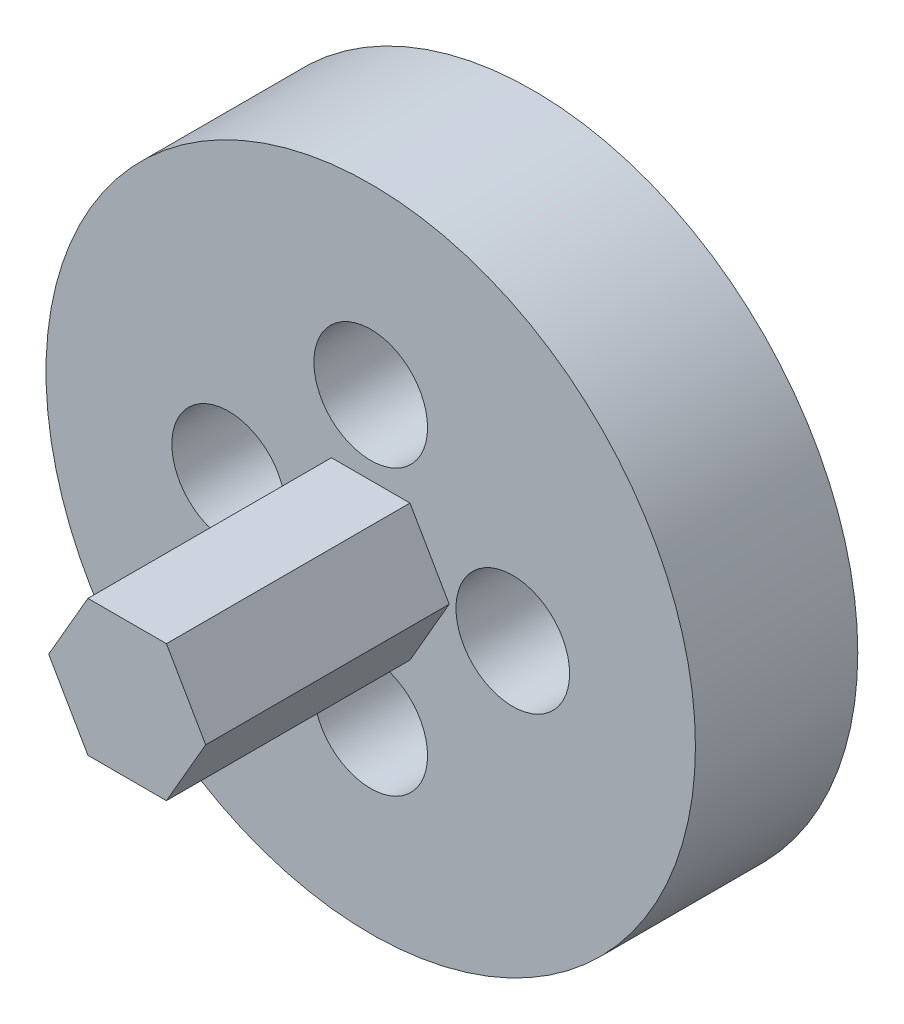
ISO-10303-21;
HEADER;
FILE_DESCRIPTION(('STEP AP214'),'2;1');
FILE_NAME('part.step','',(''),(''),'','','');
FILE_SCHEMA(('AUTOMOTIVE_DESIGN { 1 0 10303 214 1 1 1 1 }'));
ENDSEC;
DATA;
#1=APPLICATION_CONTEXT('core data for automotive mechanical design processes');
#2=APPLICATION_PROTOCOL_DEFINITION('international standard','automotive_design',2000,#1);
#3=PRODUCT_CONTEXT('',#1,'mechanical');
#4=PRODUCT('Part','Part','',(#3));
#5=PRODUCT_RELATED_PRODUCT_CATEGORY('part','',(#4));
#6=PRODUCT_DEFINITION_FORMATION('','',#4);
#7=PRODUCT_DEFINITION_CONTEXT('part definition',#1,'design');
#8=PRODUCT_DEFINITION('design','',#6,#7);
#9=PRODUCT_DEFINITION_SHAPE('','',#8);
#10=(LENGTH_UNIT() NAMED_UNIT(*) SI_UNIT(.MILLI.,.METRE.));
#11=(NAMED_UNIT(*) PLANE_ANGLE_UNIT() SI_UNIT($,.RADIAN.));
#12=(NAMED_UNIT(*) SI_UNIT($,.STERADIAN.) SOLID_ANGLE_UNIT());
#13=UNCERTAINTY_MEASURE_WITH_UNIT(LENGTH_MEASURE(1.E-05),#10,'distance_accuracy_value','');
#14=(GEOMETRIC_REPRESENTATION_CONTEXT(3) GLOBAL_UNCERTAINTY_ASSIGNED_CONTEXT((#13)) GLOBAL_UNIT_ASSIGNED_CONTEXT((#10,
#11,#12)) REPRESENTATION_CONTEXT('',''));
#15=CARTESIAN_POINT('',(0.,0.,0.));
#16=DIRECTION('',(0.,0.,1.));
#17=DIRECTION('',(1.,0.,0.));
#18=AXIS2_PLACEMENT_3D('',#15,#16,#17);
#19=CARTESIAN_POINT('',(0.,7.,2.));
#20=DIRECTION('',(0.,0.,-1.));
#21=DIRECTION('',(-1.,0.,0.));
#22=AXIS2_PLACEMENT_3D('',#19,#20,#21);
#23=CYLINDRICAL_SURFACE('',#22,1.65);
#24=CARTESIAN_POINT('',(0.,7.,0.));
#25=DIRECTION('',(0.,0.,1.));
#26=DIRECTION('',(1.,0.,0.));
#27=AXIS2_PLACEMENT_3D('',#24,#25,#26);
#28=CIRCLE('',#27,1.65);
#29=CARTESIAN_POINT('',(1.65,7.,0.));
#30=VERTEX_POINT('',#29);
#31=EDGE_CURVE('E150',#30,#30,#28,.T.);
#32=ORIENTED_EDGE('',*,*,#31,.F.);
#33=EDGE_LOOP('',(#32));
#34=FACE_BOUND('',#33,.T.);
#35=CARTESIAN_POINT('',(0.,7.,4.4));
#36=DIRECTION('',(0.,0.,1.));
#37=DIRECTION('',(1.,0.,0.));
#38=AXIS2_PLACEMENT_3D('',#35,#36,#37);
#39=CIRCLE('',#38,1.65);
#40=CARTESIAN_POINT('',(1.65,7.,4.4));
#41=VERTEX_POINT('',#40);
#42=EDGE_CURVE('E49',#41,#41,#39,.T.);
#43=ORIENTED_EDGE('',*,*,#42,.T.);
#44=EDGE_LOOP('',(#43));
#45=FACE_BOUND('',#44,.T.);
#46=ADVANCED_FACE('F45',(#34,#45),#23,.F.);
#47=CARTESIAN_POINT('',(7.,0.,2.));
#48=DIRECTION('',(0.,0.,-1.));
#49=DIRECTION('',(-1.,0.,0.));
#50=AXIS2_PLACEMENT_3D('',#47,#48,#49);
#51=CYLINDRICAL_SURFACE('',#50,1.65);
#52=CARTESIAN_POINT('',(7.,0.,0.));
#53=DIRECTION('',(0.,0.,1.));
#54=DIRECTION('',(1.,0.,0.));
#55=AXIS2_PLACEMENT_3D('',#52,#53,#54);
#56=CIRCLE('',#55,1.65);
#57=CARTESIAN_POINT('',(8.65,0.,0.));
#58=VERTEX_POINT('',#57);
#59=EDGE_CURVE('E146',#58,#58,#56,.T.);
#60=ORIENTED_EDGE('',*,*,#59,.F.);
#61=EDGE_LOOP('',(#60));
#62=FACE_BOUND('',#61,.T.);
#63=CARTESIAN_POINT('',(7.,0.,4.4));
#64=DIRECTION('',(0.,0.,1.));
#65=DIRECTION('',(1.,0.,0.));
#66=AXIS2_PLACEMENT_3D('',#63,#64,#65);
#67=CIRCLE('',#66,1.65);
#68=CARTESIAN_POINT('',(8.65,0.,4.4));
#69=VERTEX_POINT('',#68);
#70=EDGE_CURVE('E165',#69,#69,#67,.T.);
#71=ORIENTED_EDGE('',*,*,#70,.T.);
#72=EDGE_LOOP('',(#71));
#73=FACE_BOUND('',#72,.T.);
#74=ADVANCED_FACE('F299',(#62,#73),#51,.F.);
#75=CARTESIAN_POINT('',(0.,-7.,2.));
#76=DIRECTION('',(0.,0.,-1.));
#77=DIRECTION('',(-1.,0.,0.));
#78=AXIS2_PLACEMENT_3D('',#75,#76,#77);
#79=CYLINDRICAL_SURFACE('',#78,1.65);
#80=CARTESIAN_POINT('',(0.,-7.,0.));
#81=DIRECTION('',(0.,0.,1.));
#82=DIRECTION('',(1.,0.,0.));
#83=AXIS2_PLACEMENT_3D('',#80,#81,#82);
#84=CIRCLE('',#83,1.65);
#85=CARTESIAN_POINT('',(1.65,-7.,0.));
#86=VERTEX_POINT('',#85);
#87=EDGE_CURVE('E142',#86,#86,#84,.T.);
#88=ORIENTED_EDGE('',*,*,#87,.F.);
#89=EDGE_LOOP('',(#88));
#90=FACE_BOUND('',#89,.T.);
#91=CARTESIAN_POINT('',(0.,-7.,4.4));
#92=DIRECTION('',(0.,0.,1.));
#93=DIRECTION('',(1.,0.,0.));
#94=AXIS2_PLACEMENT_3D('',#91,#92,#93);
#95=CIRCLE('',#94,1.65);
#96=CARTESIAN_POINT('',(1.65,-7.,4.4));
#97=VERTEX_POINT('',#96);
#98=EDGE_CURVE('E161',#97,#97,#95,.T.);
#99=ORIENTED_EDGE('',*,*,#98,.T.);
#100=EDGE_LOOP('',(#99));
#101=FACE_BOUND('',#100,.T.);
#102=ADVANCED_FACE('F305',(#90,#101),#79,.F.);
#103=CARTESIAN_POINT('',(-7.,0.,2.));
#104=DIRECTION('',(0.,0.,-1.));
#105=DIRECTION('',(-1.,0.,0.));
#106=AXIS2_PLACEMENT_3D('',#103,#104,#105);
#107=CYLINDRICAL_SURFACE('',#106,1.65);
#108=CARTESIAN_POINT('',(-7.,0.,0.));
#109=DIRECTION('',(0.,0.,1.));
#110=DIRECTION('',(1.,0.,0.));
#111=AXIS2_PLACEMENT_3D('',#108,#109,#110);
#112=CIRCLE('',#111,1.65);
#113=CARTESIAN_POINT('',(-5.35,0.,0.));
#114=VERTEX_POINT('',#113);
#115=EDGE_CURVE('E137',#114,#114,#112,.T.);
#116=ORIENTED_EDGE('',*,*,#115,.F.);
#117=EDGE_LOOP('',(#116));
#118=FACE_BOUND('',#117,.T.);
#119=CARTESIAN_POINT('',(-7.,0.,4.4));
#120=DIRECTION('',(0.,0.,1.));
#121=DIRECTION('',(1.,0.,0.));
#122=AXIS2_PLACEMENT_3D('',#119,#120,#121);
#123=CIRCLE('',#122,1.65);
#124=CARTESIAN_POINT('',(-5.35,0.,4.4));
#125=VERTEX_POINT('',#124);
#126=EDGE_CURVE('E157',#125,#125,#123,.T.);
#127=ORIENTED_EDGE('',*,*,#126,.T.);
#128=EDGE_LOOP('',(#127));
#129=FACE_BOUND('',#128,.T.);
#130=ADVANCED_FACE('F312',(#118,#129),#107,.F.);
#131=CARTESIAN_POINT('',(0.,0.,0.));
#132=DIRECTION('',(0.,0.,1.));
#133=DIRECTION('',(1.,0.,0.));
#134=AXIS2_PLACEMENT_3D('',#131,#132,#133);
#135=PLANE('',#134);
#136=CARTESIAN_POINT('',(0.,0.,0.));
#137=DIRECTION('',(0.,0.,1.));
#138=DIRECTION('',(1.,0.,0.));
#139=AXIS2_PLACEMENT_3D('',#136,#137,#138);
#140=CIRCLE('',#139,10.);
#141=CARTESIAN_POINT('',(10.,0.,0.));
#142=VERTEX_POINT('',#141);
#143=EDGE_CURVE('E55',#142,#142,#140,.T.);
#144=ORIENTED_EDGE('',*,*,#143,.F.);
#145=EDGE_LOOP('',(#144));
#146=FACE_BOUND('',#145,.T.);
#147=ORIENTED_EDGE('',*,*,#31,.T.);
#148=EDGE_LOOP('',(#147));
#149=FACE_BOUND('',#148,.T.);
#150=ORIENTED_EDGE('',*,*,#59,.T.);
#151=EDGE_LOOP('',(#150));
#152=FACE_BOUND('',#151,.T.);
#153=ORIENTED_EDGE('',*,*,#87,.T.);
#154=EDGE_LOOP('',(#153));
#155=FACE_BOUND('',#154,.T.);
#156=ORIENTED_EDGE('',*,*,#115,.T.);
#157=EDGE_LOOP('',(#156));
#158=FACE_BOUND('',#157,.T.);
#159=ADVANCED_FACE('F310',(#146,#149,#152,#155,#158),#135,.F.);
#160=CARTESIAN_POINT('',(0.,0.,2.));
#161=DIRECTION('',(0.,0.,-1.));
#162=DIRECTION('',(-1.,0.,0.));
#163=AXIS2_PLACEMENT_3D('',#160,#161,#162);
#164=CYLINDRICAL_SURFACE('',#163,10.);
#165=CARTESIAN_POINT('',(0.,0.,2.));
#166=DIRECTION('',(0.,0.,1.));
#167=DIRECTION('',(1.,0.,0.));
#168=AXIS2_PLACEMENT_3D('',#165,#166,#167);
#169=CIRCLE('',#168,10.);
#170=CARTESIAN_POINT('',(10.,0.,2.));
#171=VERTEX_POINT('',#170);
#172=EDGE_CURVE('E11',#171,#171,#169,.T.);
#173=ORIENTED_EDGE('',*,*,#172,.F.);
#174=EDGE_LOOP('',(#173));
#175=FACE_BOUND('',#174,.T.);
#176=ORIENTED_EDGE('',*,*,#143,.T.);
#177=EDGE_LOOP('',(#176));
#178=FACE_BOUND('',#177,.T.);
#179=ADVANCED_FACE('F47',(#175,#178),#164,.T.);
#180=CARTESIAN_POINT('',(0.,0.,2.));
#181=DIRECTION('',(0.,0.,1.));
#182=DIRECTION('',(1.,0.,0.));
#183=AXIS2_PLACEMENT_3D('',#180,#181,#182);
#184=PLANE('',#183);
#185=ORIENTED_EDGE('',*,*,#172,.T.);
#186=EDGE_LOOP('',(#185));
#187=FACE_BOUND('',#186,.T.);
#188=CARTESIAN_POINT('',(0.,0.,2.));
#189=DIRECTION('',(0.,0.,1.));
#190=DIRECTION('',(1.,0.,0.));
#191=AXIS2_PLACEMENT_3D('',#188,#189,#190);
#192=CIRCLE('',#191,16.);
#193=CARTESIAN_POINT('',(16.,0.,2.));
#194=VERTEX_POINT('',#193);
#195=EDGE_CURVE('E124',#194,#194,#192,.T.);
#196=ORIENTED_EDGE('',*,*,#195,.F.);
#197=EDGE_LOOP('',(#196));
#198=FACE_BOUND('',#197,.T.);
#199=ADVANCED_FACE('F275',(#187,#198),#184,.F.);
#200=CARTESIAN_POINT('',(0.,0.,10.));
#201=DIRECTION('',(0.,0.,1.));
#202=DIRECTION('',(1.,0.,0.));
#203=AXIS2_PLACEMENT_3D('',#200,#201,#202);
#204=PLANE('',#203);
#205=CARTESIAN_POINT('',(0.,7.,10.));
#206=DIRECTION('',(0.,0.,1.));
#207=DIRECTION('',(1.,0.,0.));
#208=AXIS2_PLACEMENT_3D('',#205,#206,#207);
#209=CIRCLE('',#208,2.8);
#210=CARTESIAN_POINT('',(2.8,7.,10.));
#211=VERTEX_POINT('',#210);
#212=EDGE_CURVE('E255',#211,#211,#209,.T.);
#213=ORIENTED_EDGE('',*,*,#212,.F.);
#214=EDGE_LOOP('',(#213));
#215=FACE_BOUND('',#214,.T.);
#216=CARTESIAN_POINT('',(7.,0.,10.));
#217=DIRECTION('',(0.,0.,1.));
#218=DIRECTION('',(1.,0.,0.));
#219=AXIS2_PLACEMENT_3D('',#216,#217,#218);
#220=CIRCLE('',#219,2.8);
#221=CARTESIAN_POINT('',(9.8,0.,10.));
#222=VERTEX_POINT('',#221);
#223=EDGE_CURVE('E251',#222,#222,#220,.T.);
#224=ORIENTED_EDGE('',*,*,#223,.F.);
#225=EDGE_LOOP('',(#224));
#226=FACE_BOUND('',#225,.T.);
#227=CARTESIAN_POINT('',(0.,-7.,10.));
#228=DIRECTION('',(0.,0.,1.));
#229=DIRECTION('',(1.,0.,0.));
#230=AXIS2_PLACEMENT_3D('',#227,#228,#229);
#231=CIRCLE('',#230,2.8);
#232=CARTESIAN_POINT('',(2.8,-7.,10.));
#233=VERTEX_POINT('',#232);
#234=EDGE_CURVE('E243',#233,#233,#231,.T.);
#235=ORIENTED_EDGE('',*,*,#234,.F.);
#236=EDGE_LOOP('',(#235));
#237=FACE_BOUND('',#236,.T.);
#238=CARTESIAN_POINT('',(-7.,0.,10.));
#239=DIRECTION('',(0.,0.,1.));
#240=DIRECTION('',(1.,0.,0.));
#241=AXIS2_PLACEMENT_3D('',#238,#239,#240);
#242=CIRCLE('',#241,2.8);
#243=CARTESIAN_POINT('',(-4.2,0.,10.));
#244=VERTEX_POINT('',#243);
#245=EDGE_CURVE('E235',#244,#244,#242,.T.);
#246=ORIENTED_EDGE('',*,*,#245,.F.);
#247=EDGE_LOOP('',(#246));
#248=FACE_BOUND('',#247,.T.);
#249=DIRECTION('',(0.5,0.866025403784439,0.));
#250=VECTOR('',#249,1.);
#251=CARTESIAN_POINT('',(1.93412340178525,-3.35,10.));
#252=LINE('',#251,#250);
#253=CARTESIAN_POINT('',(1.93412340178525,-3.35,10.));
#254=VERTEX_POINT('',#253);
#255=CARTESIAN_POINT('',(3.86824680357049,0.,10.));
#256=VERTEX_POINT('',#255);
#257=EDGE_CURVE('E63',#254,#256,#252,.T.);
#258=ORIENTED_EDGE('',*,*,#257,.F.);
#259=DIRECTION('',(1.,0.,0.));
#260=VECTOR('',#259,1.);
#261=CARTESIAN_POINT('',(-1.93412340178525,-3.35,10.));
#262=LINE('',#261,#260);
#263=CARTESIAN_POINT('',(-1.93412340178525,-3.35,10.));
#264=VERTEX_POINT('',#263);
#265=EDGE_CURVE('E67',#264,#254,#262,.T.);
#266=ORIENTED_EDGE('',*,*,#265,.F.);
#267=DIRECTION('',(0.5,-0.866025403784439,0.));
#268=VECTOR('',#267,1.);
#269=CARTESIAN_POINT('',(-3.86824680357049,0.,10.));
#270=LINE('',#269,#268);
#271=CARTESIAN_POINT('',(-3.86824680357049,0.,10.));
#272=VERTEX_POINT('',#271);
#273=EDGE_CURVE('E190',#272,#264,#270,.T.);
#274=ORIENTED_EDGE('',*,*,#273,.F.);
#275=DIRECTION('',(-0.5,-0.866025403784439,0.));
#276=VECTOR('',#275,1.);
#277=CARTESIAN_POINT('',(-1.93412340178525,3.35,10.));
#278=LINE('',#277,#276);
#279=CARTESIAN_POINT('',(-1.93412340178525,3.35,10.));
#280=VERTEX_POINT('',#279);
#281=EDGE_CURVE('E186',#280,#272,#278,.T.);
#282=ORIENTED_EDGE('',*,*,#281,.F.);
#283=DIRECTION('',(-1.,0.,0.));
#284=VECTOR('',#283,1.);
#285=CARTESIAN_POINT('',(1.93412340178524,3.35,10.));
#286=LINE('',#285,#284);
#287=CARTESIAN_POINT('',(1.93412340178524,3.35,10.));
#288=VERTEX_POINT('',#287);
#289=EDGE_CURVE('E178',#288,#280,#286,.T.);
#290=ORIENTED_EDGE('',*,*,#289,.F.);
#291=DIRECTION('',(-0.5,0.866025403784439,0.));
#292=VECTOR('',#291,1.);
#293=CARTESIAN_POINT('',(3.86824680357049,0.,10.));
#294=LINE('',#293,#292);
#295=EDGE_CURVE('E175',#256,#288,#294,.T.);
#296=ORIENTED_EDGE('',*,*,#295,.F.);
#297=EDGE_LOOP('',(#258,#266,#274,#282,#290,#296));
#298=FACE_BOUND('',#297,.T.);
#299=CARTESIAN_POINT('',(0.,0.,10.));
#300=DIRECTION('',(0.,0.,1.));
#301=DIRECTION('',(1.,0.,0.));
#302=AXIS2_PLACEMENT_3D('',#299,#300,#301);
#303=CIRCLE('',#302,16.);
#304=CARTESIAN_POINT('',(16.,0.,10.));
#305=VERTEX_POINT('',#304);
#306=EDGE_CURVE('E129',#305,#305,#303,.T.);
#307=ORIENTED_EDGE('',*,*,#306,.T.);
#308=EDGE_LOOP('',(#307));
#309=FACE_BOUND('',#308,.T.);
#310=ADVANCED_FACE('F215',(#215,#226,#237,#248,#298,#309),#204,.T.);
#311=CARTESIAN_POINT('',(0.,0.,10.));
#312=DIRECTION('',(0.,0.,-1.));
#313=DIRECTION('',(-1.,0.,0.));
#314=AXIS2_PLACEMENT_3D('',#311,#312,#313);
#315=CYLINDRICAL_SURFACE('',#314,16.);
#316=ORIENTED_EDGE('',*,*,#306,.F.);
#317=EDGE_LOOP('',(#316));
#318=FACE_BOUND('',#317,.T.);
#319=ORIENTED_EDGE('',*,*,#195,.T.);
#320=EDGE_LOOP('',(#319));
#321=FACE_BOUND('',#320,.T.);
#322=ADVANCED_FACE('F274',(#318,#321),#315,.T.);
#323=CARTESIAN_POINT('',(1.93412340178525,-3.35,22.));
#324=DIRECTION('',(-0.866025403784439,0.5,0.));
#325=DIRECTION('',(-0.5,-0.866025403784439,0.));
#326=AXIS2_PLACEMENT_3D('',#323,#324,#325);
#327=PLANE('',#326);
#328=ORIENTED_EDGE('',*,*,#257,.T.);
#329=DIRECTION('',(0.,0.,-1.));
#330=VECTOR('',#329,1.);
#331=CARTESIAN_POINT('',(3.86824680357049,0.,22.));
#332=LINE('',#331,#330);
#333=CARTESIAN_POINT('',(3.86824680357049,0.,22.));
#334=VERTEX_POINT('',#333);
#335=EDGE_CURVE('E104',#334,#256,#332,.T.);
#336=ORIENTED_EDGE('',*,*,#335,.F.);
#337=DIRECTION('',(0.5,0.866025403784439,0.));
#338=VECTOR('',#337,1.);
#339=CARTESIAN_POINT('',(1.93412340178525,-3.35,22.));
#340=LINE('',#339,#338);
#341=CARTESIAN_POINT('',(1.93412340178525,-3.35,22.));
#342=VERTEX_POINT('',#341);
#343=EDGE_CURVE('E111',#342,#334,#340,.T.);
#344=ORIENTED_EDGE('',*,*,#343,.F.);
#345=DIRECTION('',(0.,0.,-1.));
#346=VECTOR('',#345,1.);
#347=CARTESIAN_POINT('',(1.93412340178525,-3.35,22.));
#348=LINE('',#347,#346);
#349=EDGE_CURVE('E195',#342,#254,#348,.T.);
#350=ORIENTED_EDGE('',*,*,#349,.T.);
#351=EDGE_LOOP('',(#328,#336,#344,#350));
#352=FACE_BOUND('',#351,.T.);
#353=ADVANCED_FACE('F122',(#352),#327,.F.);
#354=CARTESIAN_POINT('',(3.86824680357049,0.,22.));
#355=DIRECTION('',(-0.866025403784439,-0.5,0.));
#356=DIRECTION('',(0.5,-0.866025403784439,0.));
#357=AXIS2_PLACEMENT_3D('',#354,#355,#356);
#358=PLANE('',#357);
#359=ORIENTED_EDGE('',*,*,#295,.T.);
#360=DIRECTION('',(0.,0.,-1.));
#361=VECTOR('',#360,1.);
#362=CARTESIAN_POINT('',(1.93412340178524,3.35,22.));
#363=LINE('',#362,#361);
#364=CARTESIAN_POINT('',(1.93412340178524,3.35,22.));
#365=VERTEX_POINT('',#364);
#366=EDGE_CURVE('E106',#365,#288,#363,.T.);
#367=ORIENTED_EDGE('',*,*,#366,.F.);
#368=DIRECTION('',(-0.5,0.866025403784439,0.));
#369=VECTOR('',#368,1.);
#370=CARTESIAN_POINT('',(3.86824680357049,0.,22.));
#371=LINE('',#370,#369);
#372=EDGE_CURVE('E99',#334,#365,#371,.T.);
#373=ORIENTED_EDGE('',*,*,#372,.F.);
#374=ORIENTED_EDGE('',*,*,#335,.T.);
#375=EDGE_LOOP('',(#359,#367,#373,#374));
#376=FACE_BOUND('',#375,.T.);
#377=ADVANCED_FACE('F102',(#376),#358,.F.);
#378=CARTESIAN_POINT('',(1.93412340178524,3.35,22.));
#379=DIRECTION('',(0.,-1.,0.));
#380=DIRECTION('',(0.,0.,-1.));
#381=AXIS2_PLACEMENT_3D('',#378,#379,#380);
#382=PLANE('',#381);
#383=ORIENTED_EDGE('',*,*,#289,.T.);
#384=DIRECTION('',(0.,0.,-1.));
#385=VECTOR('',#384,1.);
#386=CARTESIAN_POINT('',(-1.93412340178525,3.35,22.));
#387=LINE('',#386,#385);
#388=CARTESIAN_POINT('',(-1.93412340178525,3.35,22.));
#389=VERTEX_POINT('',#388);
#390=EDGE_CURVE('E131',#389,#280,#387,.T.);
#391=ORIENTED_EDGE('',*,*,#390,.F.);
#392=DIRECTION('',(-1.,0.,0.));
#393=VECTOR('',#392,1.);
#394=CARTESIAN_POINT('',(1.93412340178524,3.35,22.));
#395=LINE('',#394,#393);
#396=EDGE_CURVE('E110',#365,#389,#395,.T.);
#397=ORIENTED_EDGE('',*,*,#396,.F.);
#398=ORIENTED_EDGE('',*,*,#366,.T.);
#399=EDGE_LOOP('',(#383,#391,#397,#398));
#400=FACE_BOUND('',#399,.T.);
#401=ADVANCED_FACE('F214',(#400),#382,.F.);
#402=CARTESIAN_POINT('',(-1.93412340178525,3.35,22.));
#403=DIRECTION('',(0.866025403784439,-0.5,0.));
#404=DIRECTION('',(0.5,0.866025403784439,0.));
#405=AXIS2_PLACEMENT_3D('',#402,#403,#404);
#406=PLANE('',#405);
#407=ORIENTED_EDGE('',*,*,#281,.T.);
#408=DIRECTION('',(0.,0.,-1.));
#409=VECTOR('',#408,1.);
#410=CARTESIAN_POINT('',(-3.86824680357049,0.,22.));
#411=LINE('',#410,#409);
#412=CARTESIAN_POINT('',(-3.86824680357049,0.,22.));
#413=VERTEX_POINT('',#412);
#414=EDGE_CURVE('E202',#413,#272,#411,.T.);
#415=ORIENTED_EDGE('',*,*,#414,.F.);
#416=DIRECTION('',(-0.5,-0.866025403784439,0.));
#417=VECTOR('',#416,1.);
#418=CARTESIAN_POINT('',(-1.93412340178525,3.35,22.));
#419=LINE('',#418,#417);
#420=EDGE_CURVE('E212',#389,#413,#419,.T.);
#421=ORIENTED_EDGE('',*,*,#420,.F.);
#422=ORIENTED_EDGE('',*,*,#390,.T.);
#423=EDGE_LOOP('',(#407,#415,#421,#422));
#424=FACE_BOUND('',#423,.T.);
#425=ADVANCED_FACE('F210',(#424),#406,.F.);
#426=CARTESIAN_POINT('',(-3.86824680357049,0.,22.));
#427=DIRECTION('',(0.866025403784438,0.5,0.));
#428=DIRECTION('',(-0.5,0.866025403784439,0.));
#429=AXIS2_PLACEMENT_3D('',#426,#427,#428);
#430=PLANE('',#429);
#431=ORIENTED_EDGE('',*,*,#273,.T.);
#432=DIRECTION('',(0.,0.,-1.));
#433=VECTOR('',#432,1.);
#434=CARTESIAN_POINT('',(-1.93412340178525,-3.35,22.));
#435=LINE('',#434,#433);
#436=CARTESIAN_POINT('',(-1.93412340178525,-3.35,22.));
#437=VERTEX_POINT('',#436);
#438=EDGE_CURVE('E198',#437,#264,#435,.T.);
#439=ORIENTED_EDGE('',*,*,#438,.F.);
#440=DIRECTION('',(0.5,-0.866025403784439,0.));
#441=VECTOR('',#440,1.);
#442=CARTESIAN_POINT('',(-3.86824680357049,0.,22.));
#443=LINE('',#442,#441);
#444=EDGE_CURVE('E224',#413,#437,#443,.T.);
#445=ORIENTED_EDGE('',*,*,#444,.F.);
#446=ORIENTED_EDGE('',*,*,#414,.T.);
#447=EDGE_LOOP('',(#431,#439,#445,#446));
#448=FACE_BOUND('',#447,.T.);
#449=ADVANCED_FACE('F219',(#448),#430,.F.);
#450=CARTESIAN_POINT('',(-1.93412340178525,-3.35,22.));
#451=DIRECTION('',(0.,1.,0.));
#452=DIRECTION('',(-1.,0.,0.));
#453=AXIS2_PLACEMENT_3D('',#450,#451,#452);
#454=PLANE('',#453);
#455=ORIENTED_EDGE('',*,*,#265,.T.);
#456=ORIENTED_EDGE('',*,*,#349,.F.);
#457=DIRECTION('',(1.,0.,0.));
#458=VECTOR('',#457,1.);
#459=CARTESIAN_POINT('',(-1.93412340178525,-3.35,22.));
#460=LINE('',#459,#458);
#461=EDGE_CURVE('E116',#437,#342,#460,.T.);
#462=ORIENTED_EDGE('',*,*,#461,.F.);
#463=ORIENTED_EDGE('',*,*,#438,.T.);
#464=EDGE_LOOP('',(#455,#456,#462,#463));
#465=FACE_BOUND('',#464,.T.);
#466=ADVANCED_FACE('F222',(#465),#454,.F.);
#467=CARTESIAN_POINT('',(0.,0.,22.));
#468=DIRECTION('',(0.,0.,1.));
#469=DIRECTION('',(1.,0.,0.));
#470=AXIS2_PLACEMENT_3D('',#467,#468,#469);
#471=PLANE('',#470);
#472=ORIENTED_EDGE('',*,*,#343,.T.);
#473=ORIENTED_EDGE('',*,*,#372,.T.);
#474=ORIENTED_EDGE('',*,*,#396,.T.);
#475=ORIENTED_EDGE('',*,*,#420,.T.);
#476=ORIENTED_EDGE('',*,*,#444,.T.);
#477=ORIENTED_EDGE('',*,*,#461,.T.);
#478=EDGE_LOOP('',(#472,#473,#474,#475,#476,#477));
#479=FACE_BOUND('',#478,.T.);
#480=ADVANCED_FACE('F114',(#479),#471,.T.);
#481=CARTESIAN_POINT('',(-7.,0.,4.4));
#482=DIRECTION('',(0.,0.,1.));
#483=DIRECTION('',(1.,0.,0.));
#484=AXIS2_PLACEMENT_3D('',#481,#482,#483);
#485=CYLINDRICAL_SURFACE('',#484,2.8);
#486=CARTESIAN_POINT('',(-7.,0.,4.4));
#487=DIRECTION('',(0.,0.,1.));
#488=DIRECTION('',(1.,0.,0.));
#489=AXIS2_PLACEMENT_3D('',#486,#487,#488);
#490=CIRCLE('',#489,2.8);
#491=CARTESIAN_POINT('',(-4.2,0.,4.4));
#492=VERTEX_POINT('',#491);
#493=EDGE_CURVE('E231',#492,#492,#490,.T.);
#494=ORIENTED_EDGE('',*,*,#493,.F.);
#495=EDGE_LOOP('',(#494));
#496=FACE_BOUND('',#495,.T.);
#497=ORIENTED_EDGE('',*,*,#245,.T.);
#498=EDGE_LOOP('',(#497));
#499=FACE_BOUND('',#498,.T.);
#500=ADVANCED_FACE('F283',(#496,#499),#485,.F.);
#501=CARTESIAN_POINT('',(-7.,0.,4.4));
#502=DIRECTION('',(0.,0.,1.));
#503=DIRECTION('',(1.,0.,0.));
#504=AXIS2_PLACEMENT_3D('',#501,#502,#503);
#505=PLANE('',#504);
#506=ORIENTED_EDGE('',*,*,#126,.F.);
#507=EDGE_LOOP('',(#506));
#508=FACE_BOUND('',#507,.T.);
#509=ORIENTED_EDGE('',*,*,#493,.T.);
#510=EDGE_LOOP('',(#509));
#511=FACE_BOUND('',#510,.T.);
#512=ADVANCED_FACE('F285',(#508,#511),#505,.T.);
#513=CARTESIAN_POINT('',(0.,-7.,4.4));
#514=DIRECTION('',(0.,0.,1.));
#515=DIRECTION('',(1.,0.,0.));
#516=AXIS2_PLACEMENT_3D('',#513,#514,#515);
#517=CYLINDRICAL_SURFACE('',#516,2.8);
#518=CARTESIAN_POINT('',(0.,-7.,4.4));
#519=DIRECTION('',(0.,0.,1.));
#520=DIRECTION('',(1.,0.,0.));
#521=AXIS2_PLACEMENT_3D('',#518,#519,#520);
#522=CIRCLE('',#521,2.8);
#523=CARTESIAN_POINT('',(2.8,-7.,4.4));
#524=VERTEX_POINT('',#523);
#525=EDGE_CURVE('E239',#524,#524,#522,.T.);
#526=ORIENTED_EDGE('',*,*,#525,.F.);
#527=EDGE_LOOP('',(#526));
#528=FACE_BOUND('',#527,.T.);
#529=ORIENTED_EDGE('',*,*,#234,.T.);
#530=EDGE_LOOP('',(#529));
#531=FACE_BOUND('',#530,.T.);
#532=ADVANCED_FACE('F291',(#528,#531),#517,.F.);
#533=CARTESIAN_POINT('',(0.,-7.,4.4));
#534=DIRECTION('',(0.,0.,1.));
#535=DIRECTION('',(1.,0.,0.));
#536=AXIS2_PLACEMENT_3D('',#533,#534,#535);
#537=PLANE('',#536);
#538=ORIENTED_EDGE('',*,*,#98,.F.);
#539=EDGE_LOOP('',(#538));
#540=FACE_BOUND('',#539,.T.);
#541=ORIENTED_EDGE('',*,*,#525,.T.);
#542=EDGE_LOOP('',(#541));
#543=FACE_BOUND('',#542,.T.);
#544=ADVANCED_FACE('F337',(#540,#543),#537,.T.);
#545=CARTESIAN_POINT('',(7.,0.,4.4));
#546=DIRECTION('',(0.,0.,1.));
#547=DIRECTION('',(1.,0.,0.));
#548=AXIS2_PLACEMENT_3D('',#545,#546,#547);
#549=CYLINDRICAL_SURFACE('',#548,2.8);
#550=CARTESIAN_POINT('',(7.,0.,4.4));
#551=DIRECTION('',(0.,0.,1.));
#552=DIRECTION('',(1.,0.,0.));
#553=AXIS2_PLACEMENT_3D('',#550,#551,#552);
#554=CIRCLE('',#553,2.8);
#555=CARTESIAN_POINT('',(9.8,0.,4.4));
#556=VERTEX_POINT('',#555);
#557=EDGE_CURVE('E247',#556,#556,#554,.T.);
#558=ORIENTED_EDGE('',*,*,#557,.F.);
#559=EDGE_LOOP('',(#558));
#560=FACE_BOUND('',#559,.T.);
#561=ORIENTED_EDGE('',*,*,#223,.T.);
#562=EDGE_LOOP('',(#561));
#563=FACE_BOUND('',#562,.T.);
#564=ADVANCED_FACE('F340',(#560,#563),#549,.F.);
#565=CARTESIAN_POINT('',(7.,0.,4.4));
#566=DIRECTION('',(0.,0.,1.));
#567=DIRECTION('',(1.,0.,0.));
#568=AXIS2_PLACEMENT_3D('',#565,#566,#567);
#569=PLANE('',#568);
#570=ORIENTED_EDGE('',*,*,#70,.F.);
#571=EDGE_LOOP('',(#570));
#572=FACE_BOUND('',#571,.T.);
#573=ORIENTED_EDGE('',*,*,#557,.T.);
#574=EDGE_LOOP('',(#573));
#575=FACE_BOUND('',#574,.T.);
#576=ADVANCED_FACE('F268',(#572,#575),#569,.T.);
#577=CARTESIAN_POINT('',(0.,7.,4.4));
#578=DIRECTION('',(0.,0.,1.));
#579=DIRECTION('',(1.,0.,0.));
#580=AXIS2_PLACEMENT_3D('',#577,#578,#579);
#581=CYLINDRICAL_SURFACE('',#580,2.8);
#582=CARTESIAN_POINT('',(0.,7.,4.4));
#583=DIRECTION('',(0.,0.,1.));
#584=DIRECTION('',(1.,0.,0.));
#585=AXIS2_PLACEMENT_3D('',#582,#583,#584);
#586=CIRCLE('',#585,2.8);
#587=CARTESIAN_POINT('',(2.8,7.,4.4));
#588=VERTEX_POINT('',#587);
#589=EDGE_CURVE('E162',#588,#588,#586,.T.);
#590=ORIENTED_EDGE('',*,*,#589,.F.);
#591=EDGE_LOOP('',(#590));
#592=FACE_BOUND('',#591,.T.);
#593=ORIENTED_EDGE('',*,*,#212,.T.);
#594=EDGE_LOOP('',(#593));
#595=FACE_BOUND('',#594,.T.);
#596=ADVANCED_FACE('F265',(#592,#595),#581,.F.);
#597=CARTESIAN_POINT('',(0.,7.,4.4));
#598=DIRECTION('',(0.,0.,1.));
#599=DIRECTION('',(1.,0.,0.));
#600=AXIS2_PLACEMENT_3D('',#597,#598,#599);
#601=PLANE('',#600);
#602=ORIENTED_EDGE('',*,*,#42,.F.);
#603=EDGE_LOOP('',(#602));
#604=FACE_BOUND('',#603,.T.);
#605=ORIENTED_EDGE('',*,*,#589,.T.);
#606=EDGE_LOOP('',(#605));
#607=FACE_BOUND('',#606,.T.);
#608=ADVANCED_FACE('F263',(#604,#607),#601,.T.);
#609=CLOSED_SHELL('',(#46,#74,#102,#130,#159,#179,#199,#310,#322,#353,#377,#401,#425,#449,#466,
#480,#500,#512,#532,#544,#564,#576,#596,#608));
#610=MANIFOLD_SOLID_BREP('B2',#609);
#611=ADVANCED_BREP_SHAPE_REPRESENTATION('',(#18,#610),#14);
#612=SHAPE_DEFINITION_REPRESENTATION(#9,#611);
ENDSEC;
END-ISO-10303-21;
